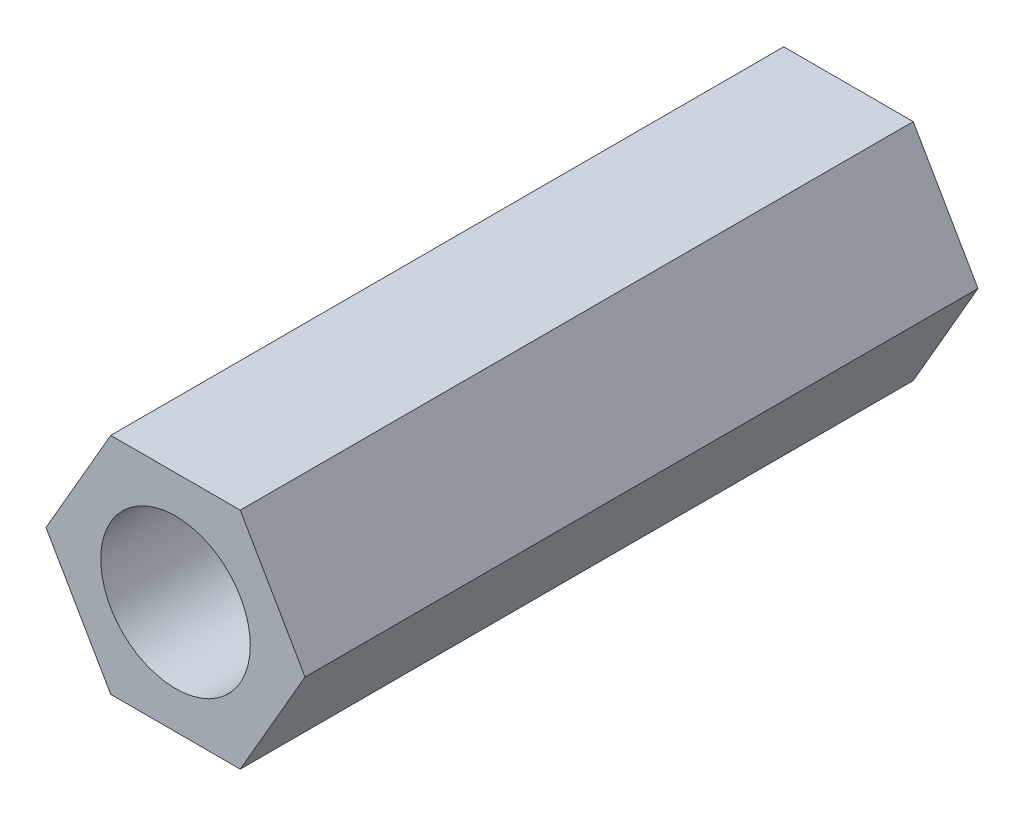
ISO-10303-21;
HEADER;
FILE_DESCRIPTION(('STEP AP214'),'2;1');
FILE_NAME('part.step','',(''),(''),'','','');
FILE_SCHEMA(('AUTOMOTIVE_DESIGN { 1 0 10303 214 1 1 1 1 }'));
ENDSEC;
DATA;
#1=APPLICATION_CONTEXT('core data for automotive mechanical design processes');
#2=APPLICATION_PROTOCOL_DEFINITION('international standard','automotive_design',2000,#1);
#3=PRODUCT_CONTEXT('',#1,'mechanical');
#4=PRODUCT('Part','Part','',(#3));
#5=PRODUCT_RELATED_PRODUCT_CATEGORY('part','',(#4));
#6=PRODUCT_DEFINITION_FORMATION('','',#4);
#7=PRODUCT_DEFINITION_CONTEXT('part definition',#1,'design');
#8=PRODUCT_DEFINITION('design','',#6,#7);
#9=PRODUCT_DEFINITION_SHAPE('','',#8);
#10=(LENGTH_UNIT() NAMED_UNIT(*) SI_UNIT(.MILLI.,.METRE.));
#11=(NAMED_UNIT(*) PLANE_ANGLE_UNIT() SI_UNIT($,.RADIAN.));
#12=(NAMED_UNIT(*) SI_UNIT($,.STERADIAN.) SOLID_ANGLE_UNIT());
#13=UNCERTAINTY_MEASURE_WITH_UNIT(LENGTH_MEASURE(1.E-05),#10,'distance_accuracy_value','');
#14=(GEOMETRIC_REPRESENTATION_CONTEXT(3) GLOBAL_UNCERTAINTY_ASSIGNED_CONTEXT((#13)) GLOBAL_UNIT_ASSIGNED_CONTEXT((#10,
#11,#12)) REPRESENTATION_CONTEXT('',''));
#15=CARTESIAN_POINT('',(0.,0.,0.));
#16=DIRECTION('',(0.,0.,1.));
#17=DIRECTION('',(1.,0.,0.));
#18=AXIS2_PLACEMENT_3D('',#15,#16,#17);
#19=CARTESIAN_POINT('',(0.,0.,9.));
#20=DIRECTION('',(0.,0.,1.));
#21=DIRECTION('',(1.,0.,0.));
#22=AXIS2_PLACEMENT_3D('',#19,#20,#21);
#23=PLANE('',#22);
#24=DIRECTION('',(0.5,0.866025403784438,0.));
#25=VECTOR('',#24,1.);
#26=CARTESIAN_POINT('',(0.86602540378444,-1.5,9.));
#27=LINE('',#26,#25);
#28=CARTESIAN_POINT('',(0.86602540378444,-1.5,9.));
#29=VERTEX_POINT('',#28);
#30=CARTESIAN_POINT('',(1.73205080756888,0.,9.));
#31=VERTEX_POINT('',#30);
#32=EDGE_CURVE('E147',#29,#31,#27,.T.);
#33=ORIENTED_EDGE('',*,*,#32,.T.);
#34=DIRECTION('',(-0.5,0.866025403784438,0.));
#35=VECTOR('',#34,1.);
#36=CARTESIAN_POINT('',(1.73205080756888,0.,9.));
#37=LINE('',#36,#35);
#38=CARTESIAN_POINT('',(0.866025403784438,1.5,9.));
#39=VERTEX_POINT('',#38);
#40=EDGE_CURVE('E95',#31,#39,#37,.T.);
#41=ORIENTED_EDGE('',*,*,#40,.T.);
#42=DIRECTION('',(-1.,0.,0.));
#43=VECTOR('',#42,1.);
#44=CARTESIAN_POINT('',(0.866025403784438,1.5,9.));
#45=LINE('',#44,#43);
#46=CARTESIAN_POINT('',(-0.866025403784439,1.5,9.));
#47=VERTEX_POINT('',#46);
#48=EDGE_CURVE('E108',#39,#47,#45,.T.);
#49=ORIENTED_EDGE('',*,*,#48,.T.);
#50=DIRECTION('',(-0.5,-0.866025403784438,0.));
#51=VECTOR('',#50,1.);
#52=CARTESIAN_POINT('',(-0.866025403784439,1.5,9.));
#53=LINE('',#52,#51);
#54=CARTESIAN_POINT('',(-1.73205080756888,0.,9.));
#55=VERTEX_POINT('',#54);
#56=EDGE_CURVE('E102',#47,#55,#53,.T.);
#57=ORIENTED_EDGE('',*,*,#56,.T.);
#58=DIRECTION('',(0.5,-0.866025403784438,0.));
#59=VECTOR('',#58,1.);
#60=CARTESIAN_POINT('',(-1.73205080756888,0.,9.));
#61=LINE('',#60,#59);
#62=CARTESIAN_POINT('',(-0.866025403784439,-1.5,9.));
#63=VERTEX_POINT('',#62);
#64=EDGE_CURVE('E106',#55,#63,#61,.T.);
#65=ORIENTED_EDGE('',*,*,#64,.T.);
#66=DIRECTION('',(1.,0.,0.));
#67=VECTOR('',#66,1.);
#68=CARTESIAN_POINT('',(-0.866025403784439,-1.5,9.));
#69=LINE('',#68,#67);
#70=EDGE_CURVE('E58',#63,#29,#69,.T.);
#71=ORIENTED_EDGE('',*,*,#70,.T.);
#72=EDGE_LOOP('',(#33,#41,#49,#57,#65,#71));
#73=FACE_BOUND('',#72,.T.);
#74=CARTESIAN_POINT('',(0.,0.,9.));
#75=DIRECTION('',(0.,0.,1.));
#76=DIRECTION('',(1.,0.,0.));
#77=AXIS2_PLACEMENT_3D('',#74,#75,#76);
#78=CIRCLE('',#77,1.);
#79=CARTESIAN_POINT('',(1.,0.,9.));
#80=VERTEX_POINT('',#79);
#81=EDGE_CURVE('E135',#80,#80,#78,.T.);
#82=ORIENTED_EDGE('',*,*,#81,.F.);
#83=EDGE_LOOP('',(#82));
#84=FACE_BOUND('',#83,.T.);
#85=ADVANCED_FACE('F40',(#73,#84),#23,.T.);
#86=CARTESIAN_POINT('',(0.,0.,0.));
#87=DIRECTION('',(0.,0.,1.));
#88=DIRECTION('',(1.,0.,0.));
#89=AXIS2_PLACEMENT_3D('',#86,#87,#88);
#90=PLANE('',#89);
#91=DIRECTION('',(0.5,0.866025403784438,0.));
#92=VECTOR('',#91,1.);
#93=CARTESIAN_POINT('',(0.86602540378444,-1.5,0.));
#94=LINE('',#93,#92);
#95=CARTESIAN_POINT('',(0.86602540378444,-1.5,0.));
#96=VERTEX_POINT('',#95);
#97=CARTESIAN_POINT('',(1.73205080756888,0.,0.));
#98=VERTEX_POINT('',#97);
#99=EDGE_CURVE('E130',#96,#98,#94,.T.);
#100=ORIENTED_EDGE('',*,*,#99,.F.);
#101=DIRECTION('',(1.,0.,0.));
#102=VECTOR('',#101,1.);
#103=CARTESIAN_POINT('',(-0.866025403784439,-1.5,0.));
#104=LINE('',#103,#102);
#105=CARTESIAN_POINT('',(-0.866025403784439,-1.5,0.));
#106=VERTEX_POINT('',#105);
#107=EDGE_CURVE('E87',#106,#96,#104,.T.);
#108=ORIENTED_EDGE('',*,*,#107,.F.);
#109=DIRECTION('',(0.5,-0.866025403784438,0.));
#110=VECTOR('',#109,1.);
#111=CARTESIAN_POINT('',(-1.73205080756888,0.,0.));
#112=LINE('',#111,#110);
#113=CARTESIAN_POINT('',(-1.73205080756888,0.,0.));
#114=VERTEX_POINT('',#113);
#115=EDGE_CURVE('E81',#114,#106,#112,.T.);
#116=ORIENTED_EDGE('',*,*,#115,.F.);
#117=DIRECTION('',(-0.5,-0.866025403784438,0.));
#118=VECTOR('',#117,1.);
#119=CARTESIAN_POINT('',(-0.866025403784439,1.5,0.));
#120=LINE('',#119,#118);
#121=CARTESIAN_POINT('',(-0.866025403784439,1.5,0.));
#122=VERTEX_POINT('',#121);
#123=EDGE_CURVE('E117',#122,#114,#120,.T.);
#124=ORIENTED_EDGE('',*,*,#123,.F.);
#125=DIRECTION('',(-1.,0.,0.));
#126=VECTOR('',#125,1.);
#127=CARTESIAN_POINT('',(0.866025403784438,1.5,0.));
#128=LINE('',#127,#126);
#129=CARTESIAN_POINT('',(0.866025403784438,1.5,0.));
#130=VERTEX_POINT('',#129);
#131=EDGE_CURVE('E138',#130,#122,#128,.T.);
#132=ORIENTED_EDGE('',*,*,#131,.F.);
#133=DIRECTION('',(-0.5,0.866025403784438,0.));
#134=VECTOR('',#133,1.);
#135=CARTESIAN_POINT('',(1.73205080756888,0.,0.));
#136=LINE('',#135,#134);
#137=EDGE_CURVE('E134',#98,#130,#136,.T.);
#138=ORIENTED_EDGE('',*,*,#137,.F.);
#139=EDGE_LOOP('',(#100,#108,#116,#124,#132,#138));
#140=FACE_BOUND('',#139,.T.);
#141=CARTESIAN_POINT('',(0.,0.,0.));
#142=DIRECTION('',(0.,0.,1.));
#143=DIRECTION('',(1.,0.,0.));
#144=AXIS2_PLACEMENT_3D('',#141,#142,#143);
#145=CIRCLE('',#144,1.);
#146=CARTESIAN_POINT('',(1.,0.,0.));
#147=VERTEX_POINT('',#146);
#148=EDGE_CURVE('E244',#147,#147,#145,.T.);
#149=ORIENTED_EDGE('',*,*,#148,.T.);
#150=EDGE_LOOP('',(#149));
#151=FACE_BOUND('',#150,.T.);
#152=ADVANCED_FACE('F160',(#140,#151),#90,.F.);
#153=CARTESIAN_POINT('',(0.86602540378444,-1.5,9.));
#154=DIRECTION('',(-0.866025403784439,0.5,0.));
#155=DIRECTION('',(-0.5,-0.866025403784439,0.));
#156=AXIS2_PLACEMENT_3D('',#153,#154,#155);
#157=PLANE('',#156);
#158=ORIENTED_EDGE('',*,*,#99,.T.);
#159=DIRECTION('',(0.,0.,-1.));
#160=VECTOR('',#159,1.);
#161=CARTESIAN_POINT('',(1.73205080756888,0.,9.));
#162=LINE('',#161,#160);
#163=EDGE_CURVE('E11',#31,#98,#162,.T.);
#164=ORIENTED_EDGE('',*,*,#163,.F.);
#165=ORIENTED_EDGE('',*,*,#32,.F.);
#166=DIRECTION('',(0.,0.,-1.));
#167=VECTOR('',#166,1.);
#168=CARTESIAN_POINT('',(0.86602540378444,-1.5,9.));
#169=LINE('',#168,#167);
#170=EDGE_CURVE('E126',#29,#96,#169,.T.);
#171=ORIENTED_EDGE('',*,*,#170,.T.);
#172=EDGE_LOOP('',(#158,#164,#165,#171));
#173=FACE_BOUND('',#172,.T.);
#174=ADVANCED_FACE('F42',(#173),#157,.F.);
#175=CARTESIAN_POINT('',(1.73205080756888,0.,9.));
#176=DIRECTION('',(-0.866025403784438,-0.5,0.));
#177=DIRECTION('',(0.5,-0.866025403784439,0.));
#178=AXIS2_PLACEMENT_3D('',#175,#176,#177);
#179=PLANE('',#178);
#180=ORIENTED_EDGE('',*,*,#137,.T.);
#181=DIRECTION('',(0.,0.,-1.));
#182=VECTOR('',#181,1.);
#183=CARTESIAN_POINT('',(0.866025403784438,1.5,9.));
#184=LINE('',#183,#182);
#185=EDGE_CURVE('E50',#39,#130,#184,.T.);
#186=ORIENTED_EDGE('',*,*,#185,.F.);
#187=ORIENTED_EDGE('',*,*,#40,.F.);
#188=ORIENTED_EDGE('',*,*,#163,.T.);
#189=EDGE_LOOP('',(#180,#186,#187,#188));
#190=FACE_BOUND('',#189,.T.);
#191=ADVANCED_FACE('F185',(#190),#179,.F.);
#192=CARTESIAN_POINT('',(0.866025403784438,1.5,9.));
#193=DIRECTION('',(0.,-1.,0.));
#194=DIRECTION('',(1.,0.,0.));
#195=AXIS2_PLACEMENT_3D('',#192,#193,#194);
#196=PLANE('',#195);
#197=ORIENTED_EDGE('',*,*,#131,.T.);
#198=DIRECTION('',(0.,0.,-1.));
#199=VECTOR('',#198,1.);
#200=CARTESIAN_POINT('',(-0.866025403784439,1.5,9.));
#201=LINE('',#200,#199);
#202=EDGE_CURVE('E119',#47,#122,#201,.T.);
#203=ORIENTED_EDGE('',*,*,#202,.F.);
#204=ORIENTED_EDGE('',*,*,#48,.F.);
#205=ORIENTED_EDGE('',*,*,#185,.T.);
#206=EDGE_LOOP('',(#197,#203,#204,#205));
#207=FACE_BOUND('',#206,.T.);
#208=ADVANCED_FACE('F157',(#207),#196,.F.);
#209=CARTESIAN_POINT('',(-0.866025403784439,1.5,9.));
#210=DIRECTION('',(0.866025403784439,-0.5,0.));
#211=DIRECTION('',(0.5,0.866025403784439,0.));
#212=AXIS2_PLACEMENT_3D('',#209,#210,#211);
#213=PLANE('',#212);
#214=ORIENTED_EDGE('',*,*,#123,.T.);
#215=DIRECTION('',(0.,0.,-1.));
#216=VECTOR('',#215,1.);
#217=CARTESIAN_POINT('',(-1.73205080756888,0.,9.));
#218=LINE('',#217,#216);
#219=EDGE_CURVE('E114',#55,#114,#218,.T.);
#220=ORIENTED_EDGE('',*,*,#219,.F.);
#221=ORIENTED_EDGE('',*,*,#56,.F.);
#222=ORIENTED_EDGE('',*,*,#202,.T.);
#223=EDGE_LOOP('',(#214,#220,#221,#222));
#224=FACE_BOUND('',#223,.T.);
#225=ADVANCED_FACE('F115',(#224),#213,.F.);
#226=CARTESIAN_POINT('',(-1.73205080756888,0.,9.));
#227=DIRECTION('',(0.866025403784438,0.5,0.));
#228=DIRECTION('',(-0.500000000000001,0.866025403784438,0.));
#229=AXIS2_PLACEMENT_3D('',#226,#227,#228);
#230=PLANE('',#229);
#231=ORIENTED_EDGE('',*,*,#115,.T.);
#232=DIRECTION('',(0.,0.,-1.));
#233=VECTOR('',#232,1.);
#234=CARTESIAN_POINT('',(-0.866025403784439,-1.5,9.));
#235=LINE('',#234,#233);
#236=EDGE_CURVE('E120',#63,#106,#235,.T.);
#237=ORIENTED_EDGE('',*,*,#236,.F.);
#238=ORIENTED_EDGE('',*,*,#64,.F.);
#239=ORIENTED_EDGE('',*,*,#219,.T.);
#240=EDGE_LOOP('',(#231,#237,#238,#239));
#241=FACE_BOUND('',#240,.T.);
#242=ADVANCED_FACE('F122',(#241),#230,.F.);
#243=CARTESIAN_POINT('',(-0.866025403784439,-1.5,9.));
#244=DIRECTION('',(0.,1.,0.));
#245=DIRECTION('',(-1.,0.,0.));
#246=AXIS2_PLACEMENT_3D('',#243,#244,#245);
#247=PLANE('',#246);
#248=ORIENTED_EDGE('',*,*,#107,.T.);
#249=ORIENTED_EDGE('',*,*,#170,.F.);
#250=ORIENTED_EDGE('',*,*,#70,.F.);
#251=ORIENTED_EDGE('',*,*,#236,.T.);
#252=EDGE_LOOP('',(#248,#249,#250,#251));
#253=FACE_BOUND('',#252,.T.);
#254=ADVANCED_FACE('F165',(#253),#247,.F.);
#255=CARTESIAN_POINT('',(0.,0.,9.));
#256=DIRECTION('',(0.,0.,-1.));
#257=DIRECTION('',(-1.,0.,0.));
#258=AXIS2_PLACEMENT_3D('',#255,#256,#257);
#259=CYLINDRICAL_SURFACE('',#258,1.);
#260=ORIENTED_EDGE('',*,*,#81,.T.);
#261=EDGE_LOOP('',(#260));
#262=FACE_BOUND('',#261,.T.);
#263=ORIENTED_EDGE('',*,*,#148,.F.);
#264=EDGE_LOOP('',(#263));
#265=FACE_BOUND('',#264,.T.);
#266=ADVANCED_FACE('F167',(#262,#265),#259,.F.);
#267=CLOSED_SHELL('',(#85,#152,#174,#191,#208,#225,#242,#254,#266));
#268=MANIFOLD_SOLID_BREP('B2',#267);
#269=ADVANCED_BREP_SHAPE_REPRESENTATION('',(#18,#268),#14);
#270=SHAPE_DEFINITION_REPRESENTATION(#9,#269);
ENDSEC;
END-ISO-10303-21;
